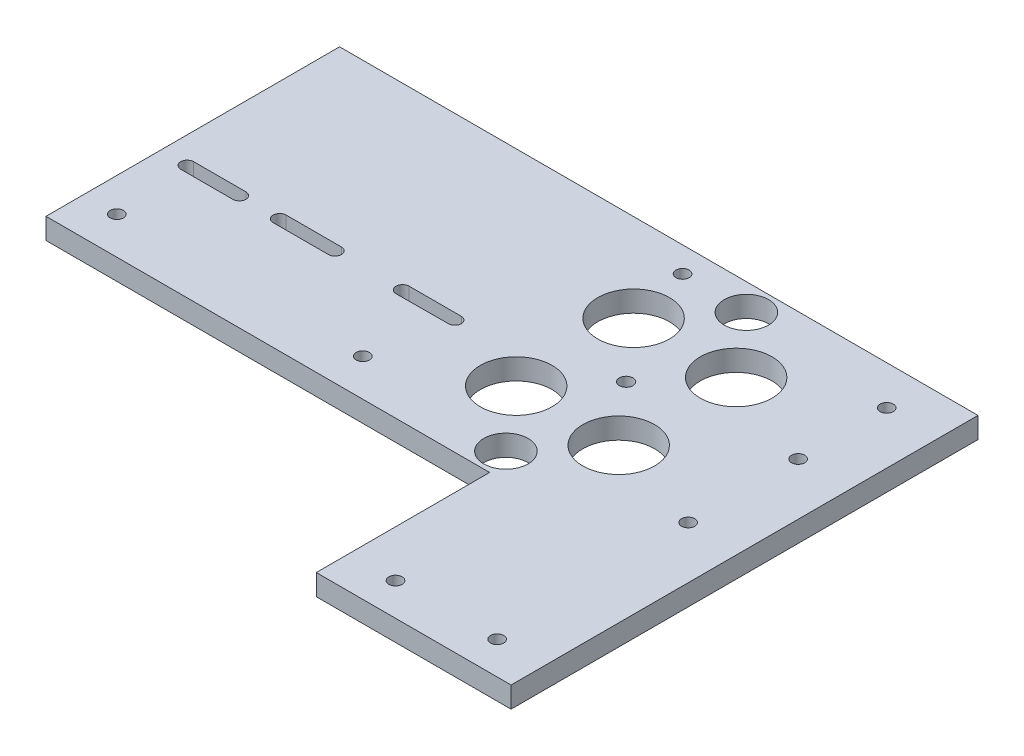
ISO-10303-21;
HEADER;
FILE_DESCRIPTION(('STEP AP214'),'2;1');
FILE_NAME('part.step','',(''),(''),'','','');
FILE_SCHEMA(('AUTOMOTIVE_DESIGN { 1 0 10303 214 1 1 1 1 }'));
ENDSEC;
DATA;
#1=APPLICATION_CONTEXT('core data for automotive mechanical design processes');
#2=APPLICATION_PROTOCOL_DEFINITION('international standard','automotive_design',2000,#1);
#3=PRODUCT_CONTEXT('',#1,'mechanical');
#4=PRODUCT('Part','Part','',(#3));
#5=PRODUCT_RELATED_PRODUCT_CATEGORY('part','',(#4));
#6=PRODUCT_DEFINITION_FORMATION('','',#4);
#7=PRODUCT_DEFINITION_CONTEXT('part definition',#1,'design');
#8=PRODUCT_DEFINITION('design','',#6,#7);
#9=PRODUCT_DEFINITION_SHAPE('','',#8);
#10=(LENGTH_UNIT() NAMED_UNIT(*) SI_UNIT(.MILLI.,.METRE.));
#11=(NAMED_UNIT(*) PLANE_ANGLE_UNIT() SI_UNIT($,.RADIAN.));
#12=(NAMED_UNIT(*) SI_UNIT($,.STERADIAN.) SOLID_ANGLE_UNIT());
#13=UNCERTAINTY_MEASURE_WITH_UNIT(LENGTH_MEASURE(1.E-05),#10,'distance_accuracy_value','');
#14=(GEOMETRIC_REPRESENTATION_CONTEXT(3) GLOBAL_UNCERTAINTY_ASSIGNED_CONTEXT((#13)) GLOBAL_UNIT_ASSIGNED_CONTEXT((#10,
#11,#12)) REPRESENTATION_CONTEXT('',''));
#15=CARTESIAN_POINT('',(0.,0.,0.));
#16=DIRECTION('',(0.,0.,1.));
#17=DIRECTION('',(1.,0.,0.));
#18=AXIS2_PLACEMENT_3D('',#15,#16,#17);
#19=CARTESIAN_POINT('',(55.88,5.715,0.));
#20=DIRECTION('',(1.,0.,0.));
#21=DIRECTION('',(0.,0.,-1.));
#22=AXIS2_PLACEMENT_3D('',#19,#20,#21);
#23=PLANE('',#22);
#24=DIRECTION('',(0.,0.,1.));
#25=VECTOR('',#24,1.);
#26=CARTESIAN_POINT('',(55.88,0.,0.));
#27=LINE('',#26,#25);
#28=CARTESIAN_POINT('',(55.88,0.,-40.005));
#29=VERTEX_POINT('',#28);
#30=CARTESIAN_POINT('',(55.88,0.,87.249));
#31=VERTEX_POINT('',#30);
#32=EDGE_CURVE('E314',#29,#31,#27,.T.);
#33=ORIENTED_EDGE('',*,*,#32,.F.);
#34=DIRECTION('',(0.,-1.,0.));
#35=VECTOR('',#34,1.);
#36=CARTESIAN_POINT('',(55.88,5.715,-40.005));
#37=LINE('',#36,#35);
#38=CARTESIAN_POINT('',(55.88,5.715,-40.005));
#39=VERTEX_POINT('',#38);
#40=EDGE_CURVE('E11',#39,#29,#37,.T.);
#41=ORIENTED_EDGE('',*,*,#40,.F.);
#42=DIRECTION('',(0.,0.,1.));
#43=VECTOR('',#42,1.);
#44=CARTESIAN_POINT('',(55.88,5.715,0.));
#45=LINE('',#44,#43);
#46=CARTESIAN_POINT('',(55.88,5.715,87.249));
#47=VERTEX_POINT('',#46);
#48=EDGE_CURVE('E315',#39,#47,#45,.T.);
#49=ORIENTED_EDGE('',*,*,#48,.T.);
#50=DIRECTION('',(0.,-1.,0.));
#51=VECTOR('',#50,1.);
#52=CARTESIAN_POINT('',(55.88,5.715,87.249));
#53=LINE('',#52,#51);
#54=EDGE_CURVE('E349',#47,#31,#53,.T.);
#55=ORIENTED_EDGE('',*,*,#54,.T.);
#56=EDGE_LOOP('',(#33,#41,#49,#55));
#57=FACE_BOUND('',#56,.T.);
#58=ADVANCED_FACE('F39',(#57),#23,.T.);
#59=CARTESIAN_POINT('',(0.,5.715,-40.005));
#60=DIRECTION('',(0.,0.,-1.));
#61=DIRECTION('',(-1.,0.,0.));
#62=AXIS2_PLACEMENT_3D('',#59,#60,#61);
#63=PLANE('',#62);
#64=DIRECTION('',(1.,0.,0.));
#65=VECTOR('',#64,1.);
#66=CARTESIAN_POINT('',(0.,0.,-40.005));
#67=LINE('',#66,#65);
#68=CARTESIAN_POINT('',(-118.11,0.,-40.005));
#69=VERTEX_POINT('',#68);
#70=EDGE_CURVE('E352',#69,#29,#67,.T.);
#71=ORIENTED_EDGE('',*,*,#70,.F.);
#72=DIRECTION('',(0.,-1.,0.));
#73=VECTOR('',#72,1.);
#74=CARTESIAN_POINT('',(-118.11,5.715,-40.005));
#75=LINE('',#74,#73);
#76=CARTESIAN_POINT('',(-118.11,5.715,-40.005));
#77=VERTEX_POINT('',#76);
#78=EDGE_CURVE('E46',#77,#69,#75,.T.);
#79=ORIENTED_EDGE('',*,*,#78,.F.);
#80=DIRECTION('',(1.,0.,0.));
#81=VECTOR('',#80,1.);
#82=CARTESIAN_POINT('',(0.,5.715,-40.005));
#83=LINE('',#82,#81);
#84=EDGE_CURVE('E318',#77,#39,#83,.T.);
#85=ORIENTED_EDGE('',*,*,#84,.T.);
#86=ORIENTED_EDGE('',*,*,#40,.T.);
#87=EDGE_LOOP('',(#71,#79,#85,#86));
#88=FACE_BOUND('',#87,.T.);
#89=ADVANCED_FACE('F402',(#88),#63,.T.);
#90=CARTESIAN_POINT('',(-118.11,5.715,0.));
#91=DIRECTION('',(1.,0.,0.));
#92=DIRECTION('',(0.,0.,-1.));
#93=AXIS2_PLACEMENT_3D('',#90,#91,#92);
#94=PLANE('',#93);
#95=DIRECTION('',(0.,0.,1.));
#96=VECTOR('',#95,1.);
#97=CARTESIAN_POINT('',(-118.11,0.,0.));
#98=LINE('',#97,#96);
#99=CARTESIAN_POINT('',(-118.11,0.,40.005));
#100=VERTEX_POINT('',#99);
#101=EDGE_CURVE('E355',#69,#100,#98,.T.);
#102=ORIENTED_EDGE('',*,*,#101,.T.);
#103=DIRECTION('',(0.,-1.,0.));
#104=VECTOR('',#103,1.);
#105=CARTESIAN_POINT('',(-118.11,5.715,40.005));
#106=LINE('',#105,#104);
#107=CARTESIAN_POINT('',(-118.11,5.715,40.005));
#108=VERTEX_POINT('',#107);
#109=EDGE_CURVE('E388',#108,#100,#106,.T.);
#110=ORIENTED_EDGE('',*,*,#109,.F.);
#111=DIRECTION('',(0.,0.,1.));
#112=VECTOR('',#111,1.);
#113=CARTESIAN_POINT('',(-118.11,5.715,0.));
#114=LINE('',#113,#112);
#115=EDGE_CURVE('E322',#77,#108,#114,.T.);
#116=ORIENTED_EDGE('',*,*,#115,.F.);
#117=ORIENTED_EDGE('',*,*,#78,.T.);
#118=EDGE_LOOP('',(#102,#110,#116,#117));
#119=FACE_BOUND('',#118,.T.);
#120=ADVANCED_FACE('F393',(#119),#94,.F.);
#121=CARTESIAN_POINT('',(0.,5.715,40.005));
#122=DIRECTION('',(0.,0.,-1.));
#123=DIRECTION('',(-1.,0.,0.));
#124=AXIS2_PLACEMENT_3D('',#121,#122,#123);
#125=PLANE('',#124);
#126=DIRECTION('',(1.,0.,0.));
#127=VECTOR('',#126,1.);
#128=CARTESIAN_POINT('',(0.,0.,40.005));
#129=LINE('',#128,#127);
#130=CARTESIAN_POINT('',(2.79400000000001,0.,40.005));
#131=VERTEX_POINT('',#130);
#132=EDGE_CURVE('E357',#100,#131,#129,.T.);
#133=ORIENTED_EDGE('',*,*,#132,.T.);
#134=DIRECTION('',(0.,-1.,0.));
#135=VECTOR('',#134,1.);
#136=CARTESIAN_POINT('',(2.79400000000001,5.715,40.005));
#137=LINE('',#136,#135);
#138=CARTESIAN_POINT('',(2.79400000000001,5.715,40.005));
#139=VERTEX_POINT('',#138);
#140=EDGE_CURVE('E385',#139,#131,#137,.T.);
#141=ORIENTED_EDGE('',*,*,#140,.F.);
#142=DIRECTION('',(1.,0.,0.));
#143=VECTOR('',#142,1.);
#144=CARTESIAN_POINT('',(0.,5.715,40.005));
#145=LINE('',#144,#143);
#146=EDGE_CURVE('E324',#108,#139,#145,.T.);
#147=ORIENTED_EDGE('',*,*,#146,.F.);
#148=ORIENTED_EDGE('',*,*,#109,.T.);
#149=EDGE_LOOP('',(#133,#141,#147,#148));
#150=FACE_BOUND('',#149,.T.);
#151=ADVANCED_FACE('F417',(#150),#125,.F.);
#152=CARTESIAN_POINT('',(2.79400000000001,5.715,0.));
#153=DIRECTION('',(1.,0.,0.));
#154=DIRECTION('',(0.,0.,-1.));
#155=AXIS2_PLACEMENT_3D('',#152,#153,#154);
#156=PLANE('',#155);
#157=DIRECTION('',(0.,0.,1.));
#158=VECTOR('',#157,1.);
#159=CARTESIAN_POINT('',(2.79400000000001,0.,0.));
#160=LINE('',#159,#158);
#161=CARTESIAN_POINT('',(2.79400000000002,0.,87.249));
#162=VERTEX_POINT('',#161);
#163=EDGE_CURVE('E359',#131,#162,#160,.T.);
#164=ORIENTED_EDGE('',*,*,#163,.T.);
#165=DIRECTION('',(0.,-1.,0.));
#166=VECTOR('',#165,1.);
#167=CARTESIAN_POINT('',(2.79400000000002,5.715,87.249));
#168=LINE('',#167,#166);
#169=CARTESIAN_POINT('',(2.79400000000002,5.715,87.249));
#170=VERTEX_POINT('',#169);
#171=EDGE_CURVE('E383',#170,#162,#168,.T.);
#172=ORIENTED_EDGE('',*,*,#171,.F.);
#173=DIRECTION('',(0.,0.,1.));
#174=VECTOR('',#173,1.);
#175=CARTESIAN_POINT('',(2.79400000000001,5.715,0.));
#176=LINE('',#175,#174);
#177=EDGE_CURVE('E326',#139,#170,#176,.T.);
#178=ORIENTED_EDGE('',*,*,#177,.F.);
#179=ORIENTED_EDGE('',*,*,#140,.T.);
#180=EDGE_LOOP('',(#164,#172,#178,#179));
#181=FACE_BOUND('',#180,.T.);
#182=ADVANCED_FACE('F413',(#181),#156,.F.);
#183=CARTESIAN_POINT('',(0.,5.715,-32.766));
#184=DIRECTION('',(0.,-1.,0.));
#185=DIRECTION('',(0.,0.,-1.));
#186=AXIS2_PLACEMENT_3D('',#183,#184,#185);
#187=CYLINDRICAL_SURFACE('',#186,6.0325);
#188=CARTESIAN_POINT('',(0.,5.715,-32.766));
#189=DIRECTION('',(0.,1.,0.));
#190=DIRECTION('',(0.,0.,1.));
#191=AXIS2_PLACEMENT_3D('',#188,#189,#190);
#192=CIRCLE('',#191,6.0325);
#193=CARTESIAN_POINT('',(0.,5.715,-26.7335));
#194=VERTEX_POINT('',#193);
#195=EDGE_CURVE('E343',#194,#194,#192,.T.);
#196=ORIENTED_EDGE('',*,*,#195,.T.);
#197=EDGE_LOOP('',(#196));
#198=FACE_BOUND('',#197,.T.);
#199=CARTESIAN_POINT('',(0.,0.,-32.766));
#200=DIRECTION('',(0.,1.,0.));
#201=DIRECTION('',(0.,0.,1.));
#202=AXIS2_PLACEMENT_3D('',#199,#200,#201);
#203=CIRCLE('',#202,6.0325);
#204=CARTESIAN_POINT('',(0.,0.,-26.7335));
#205=VERTEX_POINT('',#204);
#206=EDGE_CURVE('E377',#205,#205,#203,.T.);
#207=ORIENTED_EDGE('',*,*,#206,.F.);
#208=EDGE_LOOP('',(#207));
#209=FACE_BOUND('',#208,.T.);
#210=ADVANCED_FACE('F464',(#198,#209),#187,.F.);
#211=CARTESIAN_POINT('',(13.9699999999999,5.715,-16.002));
#212=DIRECTION('',(0.,-1.,0.));
#213=DIRECTION('',(0.,0.,-1.));
#214=AXIS2_PLACEMENT_3D('',#211,#212,#213);
#215=CYLINDRICAL_SURFACE('',#214,9.779);
#216=CARTESIAN_POINT('',(13.9699999999999,5.715,-16.002));
#217=DIRECTION('',(0.,1.,0.));
#218=DIRECTION('',(0.,0.,1.));
#219=AXIS2_PLACEMENT_3D('',#216,#217,#218);
#220=CIRCLE('',#219,9.779);
#221=CARTESIAN_POINT('',(13.9699999999999,5.715,-6.22300000000001));
#222=VERTEX_POINT('',#221);
#223=EDGE_CURVE('E340',#222,#222,#220,.F.);
#224=ORIENTED_EDGE('',*,*,#223,.F.);
#225=EDGE_LOOP('',(#224));
#226=FACE_BOUND('',#225,.T.);
#227=CARTESIAN_POINT('',(13.9699999999999,0.,-16.002));
#228=DIRECTION('',(0.,1.,0.));
#229=DIRECTION('',(0.,0.,1.));
#230=AXIS2_PLACEMENT_3D('',#227,#228,#229);
#231=CIRCLE('',#230,9.779);
#232=CARTESIAN_POINT('',(13.9699999999999,0.,-6.22300000000001));
#233=VERTEX_POINT('',#232);
#234=EDGE_CURVE('E374',#233,#233,#231,.F.);
#235=ORIENTED_EDGE('',*,*,#234,.T.);
#236=EDGE_LOOP('',(#235));
#237=FACE_BOUND('',#236,.T.);
#238=ADVANCED_FACE('F478',(#226,#237),#215,.F.);
#239=CARTESIAN_POINT('',(-13.97,5.715,-16.002));
#240=DIRECTION('',(0.,-1.,0.));
#241=DIRECTION('',(0.,0.,-1.));
#242=AXIS2_PLACEMENT_3D('',#239,#240,#241);
#243=CYLINDRICAL_SURFACE('',#242,9.779);
#244=CARTESIAN_POINT('',(-13.97,5.715,-16.002));
#245=DIRECTION('',(0.,1.,0.));
#246=DIRECTION('',(0.,0.,1.));
#247=AXIS2_PLACEMENT_3D('',#244,#245,#246);
#248=CIRCLE('',#247,9.779);
#249=CARTESIAN_POINT('',(-13.97,5.715,-6.223));
#250=VERTEX_POINT('',#249);
#251=EDGE_CURVE('E337',#250,#250,#248,.T.);
#252=ORIENTED_EDGE('',*,*,#251,.T.);
#253=EDGE_LOOP('',(#252));
#254=FACE_BOUND('',#253,.T.);
#255=CARTESIAN_POINT('',(-13.97,0.,-16.002));
#256=DIRECTION('',(0.,1.,0.));
#257=DIRECTION('',(0.,0.,1.));
#258=AXIS2_PLACEMENT_3D('',#255,#256,#257);
#259=CIRCLE('',#258,9.779);
#260=CARTESIAN_POINT('',(-13.97,0.,-6.223));
#261=VERTEX_POINT('',#260);
#262=EDGE_CURVE('E371',#261,#261,#259,.T.);
#263=ORIENTED_EDGE('',*,*,#262,.F.);
#264=EDGE_LOOP('',(#263));
#265=FACE_BOUND('',#264,.T.);
#266=ADVANCED_FACE('F474',(#254,#265),#243,.F.);
#267=CARTESIAN_POINT('',(13.9699999999999,5.715,16.002));
#268=DIRECTION('',(0.,-1.,0.));
#269=DIRECTION('',(0.,0.,-1.));
#270=AXIS2_PLACEMENT_3D('',#267,#268,#269);
#271=CYLINDRICAL_SURFACE('',#270,9.779);
#272=CARTESIAN_POINT('',(13.9699999999999,5.715,16.002));
#273=DIRECTION('',(0.,1.,0.));
#274=DIRECTION('',(0.,0.,1.));
#275=AXIS2_PLACEMENT_3D('',#272,#273,#274);
#276=CIRCLE('',#275,9.779);
#277=CARTESIAN_POINT('',(13.9699999999999,5.715,25.781));
#278=VERTEX_POINT('',#277);
#279=EDGE_CURVE('E334',#278,#278,#276,.T.);
#280=ORIENTED_EDGE('',*,*,#279,.T.);
#281=EDGE_LOOP('',(#280));
#282=FACE_BOUND('',#281,.T.);
#283=CARTESIAN_POINT('',(13.9699999999999,0.,16.002));
#284=DIRECTION('',(0.,1.,0.));
#285=DIRECTION('',(0.,0.,1.));
#286=AXIS2_PLACEMENT_3D('',#283,#284,#285);
#287=CIRCLE('',#286,9.779);
#288=CARTESIAN_POINT('',(13.9699999999999,0.,25.781));
#289=VERTEX_POINT('',#288);
#290=EDGE_CURVE('E368',#289,#289,#287,.T.);
#291=ORIENTED_EDGE('',*,*,#290,.F.);
#292=EDGE_LOOP('',(#291));
#293=FACE_BOUND('',#292,.T.);
#294=ADVANCED_FACE('F470',(#282,#293),#271,.F.);
#295=CARTESIAN_POINT('',(-13.97,5.715,16.002));
#296=DIRECTION('',(0.,-1.,0.));
#297=DIRECTION('',(0.,0.,-1.));
#298=AXIS2_PLACEMENT_3D('',#295,#296,#297);
#299=CYLINDRICAL_SURFACE('',#298,9.779);
#300=CARTESIAN_POINT('',(-13.97,5.715,16.002));
#301=DIRECTION('',(0.,1.,0.));
#302=DIRECTION('',(0.,0.,1.));
#303=AXIS2_PLACEMENT_3D('',#300,#301,#302);
#304=CIRCLE('',#303,9.779);
#305=CARTESIAN_POINT('',(-13.97,5.715,25.781));
#306=VERTEX_POINT('',#305);
#307=EDGE_CURVE('E331',#306,#306,#304,.F.);
#308=ORIENTED_EDGE('',*,*,#307,.F.);
#309=EDGE_LOOP('',(#308));
#310=FACE_BOUND('',#309,.T.);
#311=CARTESIAN_POINT('',(-13.97,0.,16.002));
#312=DIRECTION('',(0.,1.,0.));
#313=DIRECTION('',(0.,0.,1.));
#314=AXIS2_PLACEMENT_3D('',#311,#312,#313);
#315=CIRCLE('',#314,9.779);
#316=CARTESIAN_POINT('',(-13.97,0.,25.781));
#317=VERTEX_POINT('',#316);
#318=EDGE_CURVE('E365',#317,#317,#315,.F.);
#319=ORIENTED_EDGE('',*,*,#318,.T.);
#320=EDGE_LOOP('',(#319));
#321=FACE_BOUND('',#320,.T.);
#322=ADVANCED_FACE('F467',(#310,#321),#299,.F.);
#323=CARTESIAN_POINT('',(0.,5.715,87.249));
#324=DIRECTION('',(0.,0.,1.));
#325=DIRECTION('',(1.,0.,0.));
#326=AXIS2_PLACEMENT_3D('',#323,#324,#325);
#327=PLANE('',#326);
#328=DIRECTION('',(-1.,0.,0.));
#329=VECTOR('',#328,1.);
#330=CARTESIAN_POINT('',(0.,0.,87.249));
#331=LINE('',#330,#329);
#332=EDGE_CURVE('E362',#31,#162,#331,.T.);
#333=ORIENTED_EDGE('',*,*,#332,.F.);
#334=ORIENTED_EDGE('',*,*,#54,.F.);
#335=DIRECTION('',(-1.,0.,0.));
#336=VECTOR('',#335,1.);
#337=CARTESIAN_POINT('',(0.,5.715,87.249));
#338=LINE('',#337,#336);
#339=EDGE_CURVE('E328',#47,#170,#338,.T.);
#340=ORIENTED_EDGE('',*,*,#339,.T.);
#341=ORIENTED_EDGE('',*,*,#171,.T.);
#342=EDGE_LOOP('',(#333,#334,#340,#341));
#343=FACE_BOUND('',#342,.T.);
#344=ADVANCED_FACE('F408',(#343),#327,.T.);
#345=CARTESIAN_POINT('',(0.,5.715,32.766));
#346=DIRECTION('',(0.,-1.,0.));
#347=DIRECTION('',(0.,0.,-1.));
#348=AXIS2_PLACEMENT_3D('',#345,#346,#347);
#349=CYLINDRICAL_SURFACE('',#348,6.0325);
#350=CARTESIAN_POINT('',(0.,5.715,32.766));
#351=DIRECTION('',(0.,1.,0.));
#352=DIRECTION('',(0.,0.,1.));
#353=AXIS2_PLACEMENT_3D('',#350,#351,#352);
#354=CIRCLE('',#353,6.0325);
#355=CARTESIAN_POINT('',(0.,5.715,38.7985));
#356=VERTEX_POINT('',#355);
#357=EDGE_CURVE('E346',#356,#356,#354,.F.);
#358=ORIENTED_EDGE('',*,*,#357,.F.);
#359=EDGE_LOOP('',(#358));
#360=FACE_BOUND('',#359,.T.);
#361=CARTESIAN_POINT('',(0.,0.,32.766));
#362=DIRECTION('',(0.,1.,0.));
#363=DIRECTION('',(0.,0.,1.));
#364=AXIS2_PLACEMENT_3D('',#361,#362,#363);
#365=CIRCLE('',#364,6.0325);
#366=CARTESIAN_POINT('',(0.,0.,38.7985));
#367=VERTEX_POINT('',#366);
#368=EDGE_CURVE('E319',#367,#367,#365,.F.);
#369=ORIENTED_EDGE('',*,*,#368,.T.);
#370=EDGE_LOOP('',(#369));
#371=FACE_BOUND('',#370,.T.);
#372=ADVANCED_FACE('F422',(#360,#371),#349,.F.);
#373=CARTESIAN_POINT('',(0.,5.715,0.));
#374=DIRECTION('',(0.,1.,0.));
#375=DIRECTION('',(0.,0.,1.));
#376=AXIS2_PLACEMENT_3D('',#373,#374,#375);
#377=PLANE('',#376);
#378=DIRECTION('',(1.,0.,0.));
#379=VECTOR('',#378,1.);
#380=CARTESIAN_POINT('',(0.,5.715,10.5429108225078));
#381=LINE('',#380,#379);
#382=CARTESIAN_POINT('',(-85.6801299019769,5.715,10.5429108225078));
#383=VERTEX_POINT('',#382);
#384=CARTESIAN_POINT('',(-70.6016181600227,5.715,10.5429108225078));
#385=VERTEX_POINT('',#384);
#386=EDGE_CURVE('E53',#383,#385,#381,.T.);
#387=ORIENTED_EDGE('',*,*,#386,.F.);
#388=CARTESIAN_POINT('',(-85.6801299019769,5.715,8.76300000000002));
#389=DIRECTION('',(0.,1.,0.));
#390=DIRECTION('',(0.,0.,1.));
#391=AXIS2_PLACEMENT_3D('',#388,#389,#390);
#392=CIRCLE('',#391,1.77991082250782);
#393=CARTESIAN_POINT('',(-85.6801299019769,5.715,6.9830891774922));
#394=VERTEX_POINT('',#393);
#395=EDGE_CURVE('E171',#394,#383,#392,.T.);
#396=ORIENTED_EDGE('',*,*,#395,.F.);
#397=DIRECTION('',(1.,0.,0.));
#398=VECTOR('',#397,1.);
#399=CARTESIAN_POINT('',(0.,5.715,6.98308917749221));
#400=LINE('',#399,#398);
#401=CARTESIAN_POINT('',(-70.6016181600227,5.715,6.9830891774922));
#402=VERTEX_POINT('',#401);
#403=EDGE_CURVE('E194',#394,#402,#400,.T.);
#404=ORIENTED_EDGE('',*,*,#403,.T.);
#405=CARTESIAN_POINT('',(-70.6016181600227,5.715,8.76300000000002));
#406=DIRECTION('',(0.,1.,0.));
#407=DIRECTION('',(0.,0.,1.));
#408=AXIS2_PLACEMENT_3D('',#405,#406,#407);
#409=CIRCLE('',#408,1.77991082250782);
#410=EDGE_CURVE('E187',#385,#402,#409,.T.);
#411=ORIENTED_EDGE('',*,*,#410,.F.);
#412=EDGE_LOOP('',(#387,#396,#404,#411));
#413=FACE_BOUND('',#412,.T.);
#414=CARTESIAN_POINT('',(-96.6529445962825,5.715,8.76300000000002));
#415=DIRECTION('',(0.,1.,0.));
#416=DIRECTION('',(0.,0.,1.));
#417=AXIS2_PLACEMENT_3D('',#414,#415,#416);
#418=CIRCLE('',#417,1.77800000000001);
#419=CARTESIAN_POINT('',(-96.6529445962825,5.715,10.541));
#420=VERTEX_POINT('',#419);
#421=CARTESIAN_POINT('',(-96.6529445962825,5.715,6.98500000000002));
#422=VERTEX_POINT('',#421);
#423=EDGE_CURVE('E61',#420,#422,#418,.T.);
#424=ORIENTED_EDGE('',*,*,#423,.F.);
#425=DIRECTION('',(0.999999990976662,0.,0.000134337915340916));
#426=VECTOR('',#425,1.);
#427=CARTESIAN_POINT('',(-0.00141780021715812,5.715,10.5539839647415));
#428=LINE('',#427,#426);
#429=CARTESIAN_POINT('',(-110.876944467935,5.715,10.5390891774922));
#430=VERTEX_POINT('',#429);
#431=EDGE_CURVE('E217',#430,#420,#428,.T.);
#432=ORIENTED_EDGE('',*,*,#431,.F.);
#433=CARTESIAN_POINT('',(-110.876944467935,5.715,8.76108917749221));
#434=DIRECTION('',(0.,1.,0.));
#435=DIRECTION('',(0.,0.,1.));
#436=AXIS2_PLACEMENT_3D('',#433,#434,#435);
#437=CIRCLE('',#436,1.77800000000001);
#438=CARTESIAN_POINT('',(-110.876944467935,5.715,6.98308917749221));
#439=VERTEX_POINT('',#438);
#440=EDGE_CURVE('E214',#439,#430,#437,.T.);
#441=ORIENTED_EDGE('',*,*,#440,.F.);
#442=DIRECTION('',(0.999999990976662,0.,0.000134337915340916));
#443=VECTOR('',#442,1.);
#444=CARTESIAN_POINT('',(-0.000940094594516318,5.715,6.99798402891546));
#445=LINE('',#444,#443);
#446=EDGE_CURVE('E211',#439,#422,#445,.T.);
#447=ORIENTED_EDGE('',*,*,#446,.T.);
#448=EDGE_LOOP('',(#424,#432,#441,#447));
#449=FACE_BOUND('',#448,.T.);
#450=CARTESIAN_POINT('',(-37.9130723361808,5.715,8.76300000000002));
#451=DIRECTION('',(0.,1.,0.));
#452=DIRECTION('',(0.,0.,1.));
#453=AXIS2_PLACEMENT_3D('',#450,#451,#452);
#454=CIRCLE('',#453,1.75083159914467);
#455=CARTESIAN_POINT('',(-37.9130723361808,5.715,10.5138315991447));
#456=VERTEX_POINT('',#455);
#457=CARTESIAN_POINT('',(-37.9130723361808,5.715,7.01216840085537));
#458=VERTEX_POINT('',#457);
#459=EDGE_CURVE('E237',#456,#458,#454,.T.);
#460=ORIENTED_EDGE('',*,*,#459,.F.);
#461=DIRECTION('',(0.999986316175117,0.,-0.0052313920250359));
#462=VECTOR('',#461,1.);
#463=CARTESIAN_POINT('',(0.053963637556781,5.715,10.3152084320128));
#464=LINE('',#463,#462);
#465=CARTESIAN_POINT('',(-52.1370723361808,5.715,10.5882439375542));
#466=VERTEX_POINT('',#465);
#467=EDGE_CURVE('E245',#466,#456,#464,.T.);
#468=ORIENTED_EDGE('',*,*,#467,.F.);
#469=CARTESIAN_POINT('',(-52.1370723361808,5.715,8.80020616920478));
#470=DIRECTION('',(0.,1.,0.));
#471=DIRECTION('',(0.,0.,1.));
#472=AXIS2_PLACEMENT_3D('',#469,#470,#471);
#473=CIRCLE('',#472,1.78803776834941);
#474=CARTESIAN_POINT('',(-52.1370723361808,5.715,7.01216840085537));
#475=VERTEX_POINT('',#474);
#476=EDGE_CURVE('E242',#475,#466,#473,.T.);
#477=ORIENTED_EDGE('',*,*,#476,.F.);
#478=DIRECTION('',(1.,0.,0.));
#479=VECTOR('',#478,1.);
#480=CARTESIAN_POINT('',(0.,5.715,7.01216840085537));
#481=LINE('',#480,#479);
#482=EDGE_CURVE('E239',#475,#458,#481,.T.);
#483=ORIENTED_EDGE('',*,*,#482,.T.);
#484=EDGE_LOOP('',(#460,#468,#477,#483));
#485=FACE_BOUND('',#484,.T.);
#486=CARTESIAN_POINT('',(0.,5.715,0.));
#487=DIRECTION('',(0.,1.,0.));
#488=DIRECTION('',(0.,0.,1.));
#489=AXIS2_PLACEMENT_3D('',#486,#487,#488);
#490=CIRCLE('',#489,1.84999999999999);
#491=CARTESIAN_POINT('',(0.,5.715,1.84999999999999));
#492=VERTEX_POINT('',#491);
#493=EDGE_CURVE('E260',#492,#492,#490,.T.);
#494=ORIENTED_EDGE('',*,*,#493,.F.);
#495=EDGE_LOOP('',(#494));
#496=FACE_BOUND('',#495,.T.);
#497=CARTESIAN_POINT('',(-17.78,5.715,-33.147));
#498=DIRECTION('',(0.,1.,0.));
#499=DIRECTION('',(0.,0.,1.));
#500=AXIS2_PLACEMENT_3D('',#497,#498,#499);
#501=CIRCLE('',#500,1.79999999999999);
#502=CARTESIAN_POINT('',(-17.78,5.715,-31.347));
#503=VERTEX_POINT('',#502);
#504=EDGE_CURVE('E266',#503,#503,#501,.T.);
#505=ORIENTED_EDGE('',*,*,#504,.F.);
#506=EDGE_LOOP('',(#505));
#507=FACE_BOUND('',#506,.T.);
#508=CARTESIAN_POINT('',(41.656,5.715,-29.337));
#509=DIRECTION('',(0.,1.,0.));
#510=DIRECTION('',(0.,0.,1.));
#511=AXIS2_PLACEMENT_3D('',#508,#509,#510);
#512=CIRCLE('',#511,1.79999999999999);
#513=CARTESIAN_POINT('',(41.656,5.715,-27.537));
#514=VERTEX_POINT('',#513);
#515=EDGE_CURVE('E272',#514,#514,#512,.T.);
#516=ORIENTED_EDGE('',*,*,#515,.F.);
#517=EDGE_LOOP('',(#516));
#518=FACE_BOUND('',#517,.T.);
#519=CARTESIAN_POINT('',(41.656,5.715,-5.20699999999998));
#520=DIRECTION('',(0.,1.,0.));
#521=DIRECTION('',(0.,0.,1.));
#522=AXIS2_PLACEMENT_3D('',#519,#520,#521);
#523=CIRCLE('',#522,1.79999999999999);
#524=CARTESIAN_POINT('',(41.656,5.715,-3.40699999999999));
#525=VERTEX_POINT('',#524);
#526=EDGE_CURVE('E278',#525,#525,#523,.T.);
#527=ORIENTED_EDGE('',*,*,#526,.F.);
#528=EDGE_LOOP('',(#527));
#529=FACE_BOUND('',#528,.T.);
#530=CARTESIAN_POINT('',(41.656,5.715,24.765));
#531=DIRECTION('',(0.,1.,0.));
#532=DIRECTION('',(0.,0.,1.));
#533=AXIS2_PLACEMENT_3D('',#530,#531,#532);
#534=CIRCLE('',#533,1.79999999999999);
#535=CARTESIAN_POINT('',(41.656,5.715,26.565));
#536=VERTEX_POINT('',#535);
#537=EDGE_CURVE('E284',#536,#536,#534,.T.);
#538=ORIENTED_EDGE('',*,*,#537,.F.);
#539=EDGE_LOOP('',(#538));
#540=FACE_BOUND('',#539,.T.);
#541=CARTESIAN_POINT('',(43.18,5.715,78.359));
#542=DIRECTION('',(0.,1.,0.));
#543=DIRECTION('',(0.,0.,1.));
#544=AXIS2_PLACEMENT_3D('',#541,#542,#543);
#545=CIRCLE('',#544,1.79999999999999);
#546=CARTESIAN_POINT('',(43.18,5.715,80.159));
#547=VERTEX_POINT('',#546);
#548=EDGE_CURVE('E290',#547,#547,#545,.T.);
#549=ORIENTED_EDGE('',*,*,#548,.F.);
#550=EDGE_LOOP('',(#549));
#551=FACE_BOUND('',#550,.T.);
#552=CARTESIAN_POINT('',(15.494,5.715,78.359));
#553=DIRECTION('',(0.,1.,0.));
#554=DIRECTION('',(0.,0.,1.));
#555=AXIS2_PLACEMENT_3D('',#552,#553,#554);
#556=CIRCLE('',#555,1.79999999999999);
#557=CARTESIAN_POINT('',(15.494,5.715,80.159));
#558=VERTEX_POINT('',#557);
#559=EDGE_CURVE('E296',#558,#558,#556,.T.);
#560=ORIENTED_EDGE('',*,*,#559,.F.);
#561=EDGE_LOOP('',(#560));
#562=FACE_BOUND('',#561,.T.);
#563=CARTESIAN_POINT('',(-41.91,5.715,29.845));
#564=DIRECTION('',(0.,1.,0.));
#565=DIRECTION('',(0.,0.,1.));
#566=AXIS2_PLACEMENT_3D('',#563,#564,#565);
#567=CIRCLE('',#566,1.79999999999999);
#568=CARTESIAN_POINT('',(-41.91,5.715,31.645));
#569=VERTEX_POINT('',#568);
#570=EDGE_CURVE('E302',#569,#569,#567,.T.);
#571=ORIENTED_EDGE('',*,*,#570,.F.);
#572=EDGE_LOOP('',(#571));
#573=FACE_BOUND('',#572,.T.);
#574=CARTESIAN_POINT('',(-108.966,5.715,29.845));
#575=DIRECTION('',(0.,1.,0.));
#576=DIRECTION('',(0.,0.,1.));
#577=AXIS2_PLACEMENT_3D('',#574,#575,#576);
#578=CIRCLE('',#577,1.79999999999998);
#579=CARTESIAN_POINT('',(-108.966,5.715,31.645));
#580=VERTEX_POINT('',#579);
#581=EDGE_CURVE('E308',#580,#580,#578,.T.);
#582=ORIENTED_EDGE('',*,*,#581,.F.);
#583=EDGE_LOOP('',(#582));
#584=FACE_BOUND('',#583,.T.);
#585=ORIENTED_EDGE('',*,*,#48,.F.);
#586=ORIENTED_EDGE('',*,*,#84,.F.);
#587=ORIENTED_EDGE('',*,*,#115,.T.);
#588=ORIENTED_EDGE('',*,*,#146,.T.);
#589=ORIENTED_EDGE('',*,*,#177,.T.);
#590=ORIENTED_EDGE('',*,*,#339,.F.);
#591=EDGE_LOOP('',(#585,#586,#587,#588,#589,#590));
#592=FACE_BOUND('',#591,.T.);
#593=ORIENTED_EDGE('',*,*,#307,.T.);
#594=EDGE_LOOP('',(#593));
#595=FACE_BOUND('',#594,.T.);
#596=ORIENTED_EDGE('',*,*,#279,.F.);
#597=EDGE_LOOP('',(#596));
#598=FACE_BOUND('',#597,.T.);
#599=ORIENTED_EDGE('',*,*,#251,.F.);
#600=EDGE_LOOP('',(#599));
#601=FACE_BOUND('',#600,.T.);
#602=ORIENTED_EDGE('',*,*,#223,.T.);
#603=EDGE_LOOP('',(#602));
#604=FACE_BOUND('',#603,.T.);
#605=ORIENTED_EDGE('',*,*,#195,.F.);
#606=EDGE_LOOP('',(#605));
#607=FACE_BOUND('',#606,.T.);
#608=ORIENTED_EDGE('',*,*,#357,.T.);
#609=EDGE_LOOP('',(#608));
#610=FACE_BOUND('',#609,.T.);
#611=ADVANCED_FACE('F419',(#413,#449,#485,#496,#507,#518,#529,#540,#551,#562,#573,#584,#592,
#595,#598,#601,#604,#607,#610),#377,.T.);
#612=CARTESIAN_POINT('',(0.,0.,0.));
#613=DIRECTION('',(0.,1.,0.));
#614=DIRECTION('',(0.,0.,1.));
#615=AXIS2_PLACEMENT_3D('',#612,#613,#614);
#616=PLANE('',#615);
#617=CARTESIAN_POINT('',(-85.6801299019769,0.,8.76300000000002));
#618=DIRECTION('',(0.,1.,0.));
#619=DIRECTION('',(0.,0.,1.));
#620=AXIS2_PLACEMENT_3D('',#617,#618,#619);
#621=CIRCLE('',#620,1.77991082250782);
#622=CARTESIAN_POINT('',(-85.6801299019769,0.,10.5429108225078));
#623=VERTEX_POINT('',#622);
#624=CARTESIAN_POINT('',(-85.6801299019769,0.,6.9830891774922));
#625=VERTEX_POINT('',#624);
#626=EDGE_CURVE('E185',#623,#625,#621,.F.);
#627=ORIENTED_EDGE('',*,*,#626,.F.);
#628=DIRECTION('',(-1.,0.,0.));
#629=VECTOR('',#628,1.);
#630=CARTESIAN_POINT('',(0.,0.,10.5429108225078));
#631=LINE('',#630,#629);
#632=CARTESIAN_POINT('',(-70.6016181600227,0.,10.5429108225078));
#633=VERTEX_POINT('',#632);
#634=EDGE_CURVE('E165',#633,#623,#631,.T.);
#635=ORIENTED_EDGE('',*,*,#634,.F.);
#636=CARTESIAN_POINT('',(-70.6016181600227,0.,8.76300000000002));
#637=DIRECTION('',(0.,1.,0.));
#638=DIRECTION('',(0.,0.,1.));
#639=AXIS2_PLACEMENT_3D('',#636,#637,#638);
#640=CIRCLE('',#639,1.77991082250782);
#641=CARTESIAN_POINT('',(-70.6016181600227,0.,6.9830891774922));
#642=VERTEX_POINT('',#641);
#643=EDGE_CURVE('E175',#642,#633,#640,.F.);
#644=ORIENTED_EDGE('',*,*,#643,.F.);
#645=DIRECTION('',(-1.,0.,0.));
#646=VECTOR('',#645,1.);
#647=CARTESIAN_POINT('',(0.,0.,6.98308917749221));
#648=LINE('',#647,#646);
#649=EDGE_CURVE('E189',#642,#625,#648,.T.);
#650=ORIENTED_EDGE('',*,*,#649,.T.);
#651=EDGE_LOOP('',(#627,#635,#644,#650));
#652=FACE_BOUND('',#651,.T.);
#653=DIRECTION('',(-0.999999990976662,0.,-0.000134337915340916));
#654=VECTOR('',#653,1.);
#655=CARTESIAN_POINT('',(-0.00141780021715812,0.,10.5539839647415));
#656=LINE('',#655,#654);
#657=CARTESIAN_POINT('',(-96.6529445962825,0.,10.541));
#658=VERTEX_POINT('',#657);
#659=CARTESIAN_POINT('',(-110.876944467935,0.,10.5390891774922));
#660=VERTEX_POINT('',#659);
#661=EDGE_CURVE('E206',#658,#660,#656,.T.);
#662=ORIENTED_EDGE('',*,*,#661,.F.);
#663=CARTESIAN_POINT('',(-96.6529445962825,0.,8.76300000000002));
#664=DIRECTION('',(0.,1.,0.));
#665=DIRECTION('',(0.,0.,1.));
#666=AXIS2_PLACEMENT_3D('',#663,#664,#665);
#667=CIRCLE('',#666,1.77800000000001);
#668=CARTESIAN_POINT('',(-96.6529445962825,0.,6.98500000000002));
#669=VERTEX_POINT('',#668);
#670=EDGE_CURVE('E208',#669,#658,#667,.F.);
#671=ORIENTED_EDGE('',*,*,#670,.F.);
#672=DIRECTION('',(-0.999999990976662,0.,-0.000134337915340916));
#673=VECTOR('',#672,1.);
#674=CARTESIAN_POINT('',(-0.000940094594516318,0.,6.99798402891546));
#675=LINE('',#674,#673);
#676=CARTESIAN_POINT('',(-110.876944467935,0.,6.98308917749221));
#677=VERTEX_POINT('',#676);
#678=EDGE_CURVE('E223',#669,#677,#675,.T.);
#679=ORIENTED_EDGE('',*,*,#678,.T.);
#680=CARTESIAN_POINT('',(-110.876944467935,0.,8.76108917749221));
#681=DIRECTION('',(0.,1.,0.));
#682=DIRECTION('',(0.,0.,1.));
#683=AXIS2_PLACEMENT_3D('',#680,#681,#682);
#684=CIRCLE('',#683,1.77800000000001);
#685=EDGE_CURVE('E203',#660,#677,#684,.F.);
#686=ORIENTED_EDGE('',*,*,#685,.F.);
#687=EDGE_LOOP('',(#662,#671,#679,#686));
#688=FACE_BOUND('',#687,.T.);
#689=DIRECTION('',(-0.999986316175117,0.,0.0052313920250359));
#690=VECTOR('',#689,1.);
#691=CARTESIAN_POINT('',(0.053963637556781,0.,10.3152084320128));
#692=LINE('',#691,#690);
#693=CARTESIAN_POINT('',(-37.9130723361808,0.,10.5138315991447));
#694=VERTEX_POINT('',#693);
#695=CARTESIAN_POINT('',(-52.1370723361808,0.,10.5882439375542));
#696=VERTEX_POINT('',#695);
#697=EDGE_CURVE('E233',#694,#696,#692,.T.);
#698=ORIENTED_EDGE('',*,*,#697,.F.);
#699=CARTESIAN_POINT('',(-37.9130723361808,0.,8.76300000000002));
#700=DIRECTION('',(0.,1.,0.));
#701=DIRECTION('',(0.,0.,1.));
#702=AXIS2_PLACEMENT_3D('',#699,#700,#701);
#703=CIRCLE('',#702,1.75083159914467);
#704=CARTESIAN_POINT('',(-37.9130723361808,0.,7.01216840085537));
#705=VERTEX_POINT('',#704);
#706=EDGE_CURVE('E235',#705,#694,#703,.F.);
#707=ORIENTED_EDGE('',*,*,#706,.F.);
#708=DIRECTION('',(-1.,0.,0.));
#709=VECTOR('',#708,1.);
#710=CARTESIAN_POINT('',(0.,0.,7.01216840085537));
#711=LINE('',#710,#709);
#712=CARTESIAN_POINT('',(-52.1370723361808,0.,7.01216840085537));
#713=VERTEX_POINT('',#712);
#714=EDGE_CURVE('E251',#705,#713,#711,.T.);
#715=ORIENTED_EDGE('',*,*,#714,.T.);
#716=CARTESIAN_POINT('',(-52.1370723361808,0.,8.80020616920478));
#717=DIRECTION('',(0.,1.,0.));
#718=DIRECTION('',(0.,0.,1.));
#719=AXIS2_PLACEMENT_3D('',#716,#717,#718);
#720=CIRCLE('',#719,1.78803776834941);
#721=EDGE_CURVE('E179',#696,#713,#720,.F.);
#722=ORIENTED_EDGE('',*,*,#721,.F.);
#723=EDGE_LOOP('',(#698,#707,#715,#722));
#724=FACE_BOUND('',#723,.T.);
#725=CARTESIAN_POINT('',(0.,0.,0.));
#726=DIRECTION('',(0.,1.,0.));
#727=DIRECTION('',(0.,0.,1.));
#728=AXIS2_PLACEMENT_3D('',#725,#726,#727);
#729=CIRCLE('',#728,1.84999999999999);
#730=CARTESIAN_POINT('',(0.,0.,1.84999999999999));
#731=VERTEX_POINT('',#730);
#732=EDGE_CURVE('E263',#731,#731,#729,.T.);
#733=ORIENTED_EDGE('',*,*,#732,.T.);
#734=EDGE_LOOP('',(#733));
#735=FACE_BOUND('',#734,.T.);
#736=CARTESIAN_POINT('',(-17.78,0.,-33.147));
#737=DIRECTION('',(0.,1.,0.));
#738=DIRECTION('',(0.,0.,1.));
#739=AXIS2_PLACEMENT_3D('',#736,#737,#738);
#740=CIRCLE('',#739,1.79999999999999);
#741=CARTESIAN_POINT('',(-17.78,0.,-31.347));
#742=VERTEX_POINT('',#741);
#743=EDGE_CURVE('E269',#742,#742,#740,.T.);
#744=ORIENTED_EDGE('',*,*,#743,.T.);
#745=EDGE_LOOP('',(#744));
#746=FACE_BOUND('',#745,.T.);
#747=CARTESIAN_POINT('',(41.656,0.,-29.337));
#748=DIRECTION('',(0.,1.,0.));
#749=DIRECTION('',(0.,0.,1.));
#750=AXIS2_PLACEMENT_3D('',#747,#748,#749);
#751=CIRCLE('',#750,1.79999999999999);
#752=CARTESIAN_POINT('',(41.656,0.,-27.537));
#753=VERTEX_POINT('',#752);
#754=EDGE_CURVE('E275',#753,#753,#751,.T.);
#755=ORIENTED_EDGE('',*,*,#754,.T.);
#756=EDGE_LOOP('',(#755));
#757=FACE_BOUND('',#756,.T.);
#758=CARTESIAN_POINT('',(41.656,0.,-5.20699999999998));
#759=DIRECTION('',(0.,1.,0.));
#760=DIRECTION('',(0.,0.,1.));
#761=AXIS2_PLACEMENT_3D('',#758,#759,#760);
#762=CIRCLE('',#761,1.79999999999999);
#763=CARTESIAN_POINT('',(41.656,0.,-3.407));
#764=VERTEX_POINT('',#763);
#765=EDGE_CURVE('E281',#764,#764,#762,.T.);
#766=ORIENTED_EDGE('',*,*,#765,.T.);
#767=EDGE_LOOP('',(#766));
#768=FACE_BOUND('',#767,.T.);
#769=CARTESIAN_POINT('',(41.656,0.,24.765));
#770=DIRECTION('',(0.,1.,0.));
#771=DIRECTION('',(0.,0.,1.));
#772=AXIS2_PLACEMENT_3D('',#769,#770,#771);
#773=CIRCLE('',#772,1.79999999999999);
#774=CARTESIAN_POINT('',(41.656,0.,26.565));
#775=VERTEX_POINT('',#774);
#776=EDGE_CURVE('E287',#775,#775,#773,.T.);
#777=ORIENTED_EDGE('',*,*,#776,.T.);
#778=EDGE_LOOP('',(#777));
#779=FACE_BOUND('',#778,.T.);
#780=CARTESIAN_POINT('',(43.18,0.,78.359));
#781=DIRECTION('',(0.,1.,0.));
#782=DIRECTION('',(0.,0.,1.));
#783=AXIS2_PLACEMENT_3D('',#780,#781,#782);
#784=CIRCLE('',#783,1.79999999999999);
#785=CARTESIAN_POINT('',(43.18,0.,80.159));
#786=VERTEX_POINT('',#785);
#787=EDGE_CURVE('E293',#786,#786,#784,.T.);
#788=ORIENTED_EDGE('',*,*,#787,.T.);
#789=EDGE_LOOP('',(#788));
#790=FACE_BOUND('',#789,.T.);
#791=CARTESIAN_POINT('',(15.494,0.,78.359));
#792=DIRECTION('',(0.,1.,0.));
#793=DIRECTION('',(0.,0.,1.));
#794=AXIS2_PLACEMENT_3D('',#791,#792,#793);
#795=CIRCLE('',#794,1.79999999999999);
#796=CARTESIAN_POINT('',(15.494,0.,80.159));
#797=VERTEX_POINT('',#796);
#798=EDGE_CURVE('E299',#797,#797,#795,.T.);
#799=ORIENTED_EDGE('',*,*,#798,.T.);
#800=EDGE_LOOP('',(#799));
#801=FACE_BOUND('',#800,.T.);
#802=CARTESIAN_POINT('',(-41.91,0.,29.845));
#803=DIRECTION('',(0.,1.,0.));
#804=DIRECTION('',(0.,0.,1.));
#805=AXIS2_PLACEMENT_3D('',#802,#803,#804);
#806=CIRCLE('',#805,1.79999999999999);
#807=CARTESIAN_POINT('',(-41.91,0.,31.645));
#808=VERTEX_POINT('',#807);
#809=EDGE_CURVE('E305',#808,#808,#806,.T.);
#810=ORIENTED_EDGE('',*,*,#809,.T.);
#811=EDGE_LOOP('',(#810));
#812=FACE_BOUND('',#811,.T.);
#813=CARTESIAN_POINT('',(-108.966,0.,29.845));
#814=DIRECTION('',(0.,1.,0.));
#815=DIRECTION('',(0.,0.,1.));
#816=AXIS2_PLACEMENT_3D('',#813,#814,#815);
#817=CIRCLE('',#816,1.79999999999998);
#818=CARTESIAN_POINT('',(-108.966,0.,31.645));
#819=VERTEX_POINT('',#818);
#820=EDGE_CURVE('E311',#819,#819,#817,.T.);
#821=ORIENTED_EDGE('',*,*,#820,.T.);
#822=EDGE_LOOP('',(#821));
#823=FACE_BOUND('',#822,.T.);
#824=ORIENTED_EDGE('',*,*,#32,.T.);
#825=ORIENTED_EDGE('',*,*,#332,.T.);
#826=ORIENTED_EDGE('',*,*,#163,.F.);
#827=ORIENTED_EDGE('',*,*,#132,.F.);
#828=ORIENTED_EDGE('',*,*,#101,.F.);
#829=ORIENTED_EDGE('',*,*,#70,.T.);
#830=EDGE_LOOP('',(#824,#825,#826,#827,#828,#829));
#831=FACE_BOUND('',#830,.T.);
#832=ORIENTED_EDGE('',*,*,#318,.F.);
#833=EDGE_LOOP('',(#832));
#834=FACE_BOUND('',#833,.T.);
#835=ORIENTED_EDGE('',*,*,#290,.T.);
#836=EDGE_LOOP('',(#835));
#837=FACE_BOUND('',#836,.T.);
#838=ORIENTED_EDGE('',*,*,#262,.T.);
#839=EDGE_LOOP('',(#838));
#840=FACE_BOUND('',#839,.T.);
#841=ORIENTED_EDGE('',*,*,#234,.F.);
#842=EDGE_LOOP('',(#841));
#843=FACE_BOUND('',#842,.T.);
#844=ORIENTED_EDGE('',*,*,#206,.T.);
#845=EDGE_LOOP('',(#844));
#846=FACE_BOUND('',#845,.T.);
#847=ORIENTED_EDGE('',*,*,#368,.F.);
#848=EDGE_LOOP('',(#847));
#849=FACE_BOUND('',#848,.T.);
#850=ADVANCED_FACE('F182',(#652,#688,#724,#735,#746,#757,#768,#779,#790,#801,#812,#823,#831,
#834,#837,#840,#843,#846,#849),#616,.F.);
#851=CARTESIAN_POINT('',(-108.966,5.715,29.845));
#852=DIRECTION('',(0.,1.,0.));
#853=DIRECTION('',(0.,0.,1.));
#854=AXIS2_PLACEMENT_3D('',#851,#852,#853);
#855=CYLINDRICAL_SURFACE('',#854,1.79999999999998);
#856=ORIENTED_EDGE('',*,*,#581,.T.);
#857=EDGE_LOOP('',(#856));
#858=FACE_BOUND('',#857,.T.);
#859=ORIENTED_EDGE('',*,*,#820,.F.);
#860=EDGE_LOOP('',(#859));
#861=FACE_BOUND('',#860,.T.);
#862=ADVANCED_FACE('F443',(#858,#861),#855,.F.);
#863=CARTESIAN_POINT('',(-41.91,5.715,29.845));
#864=DIRECTION('',(0.,1.,0.));
#865=DIRECTION('',(0.,0.,1.));
#866=AXIS2_PLACEMENT_3D('',#863,#864,#865);
#867=CYLINDRICAL_SURFACE('',#866,1.79999999999999);
#868=ORIENTED_EDGE('',*,*,#570,.T.);
#869=EDGE_LOOP('',(#868));
#870=FACE_BOUND('',#869,.T.);
#871=ORIENTED_EDGE('',*,*,#809,.F.);
#872=EDGE_LOOP('',(#871));
#873=FACE_BOUND('',#872,.T.);
#874=ADVANCED_FACE('F448',(#870,#873),#867,.F.);
#875=CARTESIAN_POINT('',(15.494,5.715,78.359));
#876=DIRECTION('',(0.,1.,0.));
#877=DIRECTION('',(0.,0.,1.));
#878=AXIS2_PLACEMENT_3D('',#875,#876,#877);
#879=CYLINDRICAL_SURFACE('',#878,1.79999999999999);
#880=ORIENTED_EDGE('',*,*,#559,.T.);
#881=EDGE_LOOP('',(#880));
#882=FACE_BOUND('',#881,.T.);
#883=ORIENTED_EDGE('',*,*,#798,.F.);
#884=EDGE_LOOP('',(#883));
#885=FACE_BOUND('',#884,.T.);
#886=ADVANCED_FACE('F676',(#882,#885),#879,.F.);
#887=CARTESIAN_POINT('',(43.18,5.715,78.359));
#888=DIRECTION('',(0.,1.,0.));
#889=DIRECTION('',(0.,0.,1.));
#890=AXIS2_PLACEMENT_3D('',#887,#888,#889);
#891=CYLINDRICAL_SURFACE('',#890,1.79999999999999);
#892=ORIENTED_EDGE('',*,*,#548,.T.);
#893=EDGE_LOOP('',(#892));
#894=FACE_BOUND('',#893,.T.);
#895=ORIENTED_EDGE('',*,*,#787,.F.);
#896=EDGE_LOOP('',(#895));
#897=FACE_BOUND('',#896,.T.);
#898=ADVANCED_FACE('F672',(#894,#897),#891,.F.);
#899=CARTESIAN_POINT('',(41.656,5.715,24.765));
#900=DIRECTION('',(0.,1.,0.));
#901=DIRECTION('',(0.,0.,1.));
#902=AXIS2_PLACEMENT_3D('',#899,#900,#901);
#903=CYLINDRICAL_SURFACE('',#902,1.79999999999999);
#904=ORIENTED_EDGE('',*,*,#537,.T.);
#905=EDGE_LOOP('',(#904));
#906=FACE_BOUND('',#905,.T.);
#907=ORIENTED_EDGE('',*,*,#776,.F.);
#908=EDGE_LOOP('',(#907));
#909=FACE_BOUND('',#908,.T.);
#910=ADVANCED_FACE('F668',(#906,#909),#903,.F.);
#911=CARTESIAN_POINT('',(41.656,5.715,-5.20699999999998));
#912=DIRECTION('',(0.,1.,0.));
#913=DIRECTION('',(0.,0.,1.));
#914=AXIS2_PLACEMENT_3D('',#911,#912,#913);
#915=CYLINDRICAL_SURFACE('',#914,1.79999999999999);
#916=ORIENTED_EDGE('',*,*,#526,.T.);
#917=EDGE_LOOP('',(#916));
#918=FACE_BOUND('',#917,.T.);
#919=ORIENTED_EDGE('',*,*,#765,.F.);
#920=EDGE_LOOP('',(#919));
#921=FACE_BOUND('',#920,.T.);
#922=ADVANCED_FACE('F664',(#918,#921),#915,.F.);
#923=CARTESIAN_POINT('',(41.656,5.715,-29.337));
#924=DIRECTION('',(0.,1.,0.));
#925=DIRECTION('',(0.,0.,1.));
#926=AXIS2_PLACEMENT_3D('',#923,#924,#925);
#927=CYLINDRICAL_SURFACE('',#926,1.79999999999999);
#928=ORIENTED_EDGE('',*,*,#515,.T.);
#929=EDGE_LOOP('',(#928));
#930=FACE_BOUND('',#929,.T.);
#931=ORIENTED_EDGE('',*,*,#754,.F.);
#932=EDGE_LOOP('',(#931));
#933=FACE_BOUND('',#932,.T.);
#934=ADVANCED_FACE('F660',(#930,#933),#927,.F.);
#935=CARTESIAN_POINT('',(-17.78,5.715,-33.147));
#936=DIRECTION('',(0.,1.,0.));
#937=DIRECTION('',(0.,0.,1.));
#938=AXIS2_PLACEMENT_3D('',#935,#936,#937);
#939=CYLINDRICAL_SURFACE('',#938,1.79999999999999);
#940=ORIENTED_EDGE('',*,*,#504,.T.);
#941=EDGE_LOOP('',(#940));
#942=FACE_BOUND('',#941,.T.);
#943=ORIENTED_EDGE('',*,*,#743,.F.);
#944=EDGE_LOOP('',(#943));
#945=FACE_BOUND('',#944,.T.);
#946=ADVANCED_FACE('F656',(#942,#945),#939,.F.);
#947=CARTESIAN_POINT('',(0.,5.715,0.));
#948=DIRECTION('',(0.,1.,0.));
#949=DIRECTION('',(0.,0.,1.));
#950=AXIS2_PLACEMENT_3D('',#947,#948,#949);
#951=CYLINDRICAL_SURFACE('',#950,1.84999999999999);
#952=ORIENTED_EDGE('',*,*,#493,.T.);
#953=EDGE_LOOP('',(#952));
#954=FACE_BOUND('',#953,.T.);
#955=ORIENTED_EDGE('',*,*,#732,.F.);
#956=EDGE_LOOP('',(#955));
#957=FACE_BOUND('',#956,.T.);
#958=ADVANCED_FACE('F528',(#954,#957),#951,.F.);
#959=CARTESIAN_POINT('',(-37.9130723361808,-0.00100000000000013,8.76300000000002));
#960=DIRECTION('',(0.,1.,0.));
#961=DIRECTION('',(0.,0.,1.));
#962=AXIS2_PLACEMENT_3D('',#959,#960,#961);
#963=CYLINDRICAL_SURFACE('',#962,1.75083159914467);
#964=ORIENTED_EDGE('',*,*,#706,.T.);
#965=DIRECTION('',(0.,1.,0.));
#966=VECTOR('',#965,1.);
#967=CARTESIAN_POINT('',(-37.9130723361808,-0.00100000000000013,10.5138315991447));
#968=LINE('',#967,#966);
#969=EDGE_CURVE('E249',#694,#456,#968,.T.);
#970=ORIENTED_EDGE('',*,*,#969,.T.);
#971=ORIENTED_EDGE('',*,*,#459,.T.);
#972=DIRECTION('',(0.,1.,0.));
#973=VECTOR('',#972,1.);
#974=CARTESIAN_POINT('',(-37.9130723361808,-0.00100000000000013,7.01216840085536));
#975=LINE('',#974,#973);
#976=EDGE_CURVE('E248',#705,#458,#975,.T.);
#977=ORIENTED_EDGE('',*,*,#976,.F.);
#978=EDGE_LOOP('',(#964,#970,#971,#977));
#979=FACE_BOUND('',#978,.T.);
#980=ADVANCED_FACE('F540',(#979),#963,.F.);
#981=CARTESIAN_POINT('',(0.053963637556781,-0.00100000000000013,10.3152084320128));
#982=DIRECTION('',(0.0052313920250359,0.,0.999986316175117));
#983=DIRECTION('',(0.999986316175117,0.,-0.0052313920250359));
#984=AXIS2_PLACEMENT_3D('',#981,#982,#983);
#985=PLANE('',#984);
#986=ORIENTED_EDGE('',*,*,#697,.T.);
#987=DIRECTION('',(0.,1.,0.));
#988=VECTOR('',#987,1.);
#989=CARTESIAN_POINT('',(-52.1370723361808,-0.00100000000000013,10.5882439375542));
#990=LINE('',#989,#988);
#991=EDGE_CURVE('E252',#696,#466,#990,.T.);
#992=ORIENTED_EDGE('',*,*,#991,.T.);
#993=ORIENTED_EDGE('',*,*,#467,.T.);
#994=ORIENTED_EDGE('',*,*,#969,.F.);
#995=EDGE_LOOP('',(#986,#992,#993,#994));
#996=FACE_BOUND('',#995,.T.);
#997=ADVANCED_FACE('F545',(#996),#985,.F.);
#998=CARTESIAN_POINT('',(-52.1370723361808,-0.00100000000000013,8.80020616920478));
#999=DIRECTION('',(0.,1.,0.));
#1000=DIRECTION('',(0.,0.,1.));
#1001=AXIS2_PLACEMENT_3D('',#998,#999,#1000);
#1002=CYLINDRICAL_SURFACE('',#1001,1.78803776834941);
#1003=ORIENTED_EDGE('',*,*,#721,.T.);
#1004=DIRECTION('',(0.,1.,0.));
#1005=VECTOR('',#1004,1.);
#1006=CARTESIAN_POINT('',(-52.1370723361808,-0.00100000000000013,7.01216840085537));
#1007=LINE('',#1006,#1005);
#1008=EDGE_CURVE('E254',#713,#475,#1007,.T.);
#1009=ORIENTED_EDGE('',*,*,#1008,.T.);
#1010=ORIENTED_EDGE('',*,*,#476,.T.);
#1011=ORIENTED_EDGE('',*,*,#991,.F.);
#1012=EDGE_LOOP('',(#1003,#1009,#1010,#1011));
#1013=FACE_BOUND('',#1012,.T.);
#1014=ADVANCED_FACE('F555',(#1013),#1002,.F.);
#1015=CARTESIAN_POINT('',(0.,-0.00100000000000013,7.01216840085537));
#1016=DIRECTION('',(0.,0.,1.));
#1017=DIRECTION('',(1.,0.,0.));
#1018=AXIS2_PLACEMENT_3D('',#1015,#1016,#1017);
#1019=PLANE('',#1018);
#1020=ORIENTED_EDGE('',*,*,#976,.T.);
#1021=ORIENTED_EDGE('',*,*,#482,.F.);
#1022=ORIENTED_EDGE('',*,*,#1008,.F.);
#1023=ORIENTED_EDGE('',*,*,#714,.F.);
#1024=EDGE_LOOP('',(#1020,#1021,#1022,#1023));
#1025=FACE_BOUND('',#1024,.T.);
#1026=ADVANCED_FACE('F565',(#1025),#1019,.T.);
#1027=CARTESIAN_POINT('',(-96.6529445962825,-0.00100000000000013,8.76300000000002));
#1028=DIRECTION('',(0.,1.,0.));
#1029=DIRECTION('',(0.,0.,1.));
#1030=AXIS2_PLACEMENT_3D('',#1027,#1028,#1029);
#1031=CYLINDRICAL_SURFACE('',#1030,1.77800000000001);
#1032=ORIENTED_EDGE('',*,*,#670,.T.);
#1033=DIRECTION('',(0.,1.,0.));
#1034=VECTOR('',#1033,1.);
#1035=CARTESIAN_POINT('',(-96.6529445962825,-0.00100000000000013,10.541));
#1036=LINE('',#1035,#1034);
#1037=EDGE_CURVE('E221',#658,#420,#1036,.T.);
#1038=ORIENTED_EDGE('',*,*,#1037,.T.);
#1039=ORIENTED_EDGE('',*,*,#423,.T.);
#1040=DIRECTION('',(0.,1.,0.));
#1041=VECTOR('',#1040,1.);
#1042=CARTESIAN_POINT('',(-96.6529445962825,-0.00100000000000013,6.98500000000002));
#1043=LINE('',#1042,#1041);
#1044=EDGE_CURVE('E220',#669,#422,#1043,.T.);
#1045=ORIENTED_EDGE('',*,*,#1044,.F.);
#1046=EDGE_LOOP('',(#1032,#1038,#1039,#1045));
#1047=FACE_BOUND('',#1046,.T.);
#1048=ADVANCED_FACE('F575',(#1047),#1031,.F.);
#1049=CARTESIAN_POINT('',(-0.00141780021715812,-0.00100000000000013,10.5539839647415));
#1050=DIRECTION('',(-0.000134337915340916,0.,0.999999990976662));
#1051=DIRECTION('',(0.999999990976662,0.,0.000134337915340916));
#1052=AXIS2_PLACEMENT_3D('',#1049,#1050,#1051);
#1053=PLANE('',#1052);
#1054=ORIENTED_EDGE('',*,*,#661,.T.);
#1055=DIRECTION('',(0.,1.,0.));
#1056=VECTOR('',#1055,1.);
#1057=CARTESIAN_POINT('',(-110.876944467935,-0.00100000000000013,10.5390891774922));
#1058=LINE('',#1057,#1056);
#1059=EDGE_CURVE('E224',#660,#430,#1058,.T.);
#1060=ORIENTED_EDGE('',*,*,#1059,.T.);
#1061=ORIENTED_EDGE('',*,*,#431,.T.);
#1062=ORIENTED_EDGE('',*,*,#1037,.F.);
#1063=EDGE_LOOP('',(#1054,#1060,#1061,#1062));
#1064=FACE_BOUND('',#1063,.T.);
#1065=ADVANCED_FACE('F585',(#1064),#1053,.F.);
#1066=CARTESIAN_POINT('',(-110.876944467935,-0.00100000000000013,8.76108917749221));
#1067=DIRECTION('',(0.,1.,0.));
#1068=DIRECTION('',(0.,0.,1.));
#1069=AXIS2_PLACEMENT_3D('',#1066,#1067,#1068);
#1070=CYLINDRICAL_SURFACE('',#1069,1.77800000000001);
#1071=ORIENTED_EDGE('',*,*,#685,.T.);
#1072=DIRECTION('',(0.,1.,0.));
#1073=VECTOR('',#1072,1.);
#1074=CARTESIAN_POINT('',(-110.876944467935,-0.00100000000000013,6.98308917749221));
#1075=LINE('',#1074,#1073);
#1076=EDGE_CURVE('E226',#677,#439,#1075,.T.);
#1077=ORIENTED_EDGE('',*,*,#1076,.T.);
#1078=ORIENTED_EDGE('',*,*,#440,.T.);
#1079=ORIENTED_EDGE('',*,*,#1059,.F.);
#1080=EDGE_LOOP('',(#1071,#1077,#1078,#1079));
#1081=FACE_BOUND('',#1080,.T.);
#1082=ADVANCED_FACE('F594',(#1081),#1070,.F.);
#1083=CARTESIAN_POINT('',(-0.000940094594516318,-0.00100000000000013,6.99798402891546));
#1084=DIRECTION('',(-0.000134337915340916,0.,0.999999990976662));
#1085=DIRECTION('',(0.999999990976662,0.,0.000134337915340916));
#1086=AXIS2_PLACEMENT_3D('',#1083,#1084,#1085);
#1087=PLANE('',#1086);
#1088=ORIENTED_EDGE('',*,*,#1044,.T.);
#1089=ORIENTED_EDGE('',*,*,#446,.F.);
#1090=ORIENTED_EDGE('',*,*,#1076,.F.);
#1091=ORIENTED_EDGE('',*,*,#678,.F.);
#1092=EDGE_LOOP('',(#1088,#1089,#1090,#1091));
#1093=FACE_BOUND('',#1092,.T.);
#1094=ADVANCED_FACE('F604',(#1093),#1087,.T.);
#1095=CARTESIAN_POINT('',(0.,-0.00100000000000013,10.5429108225078));
#1096=DIRECTION('',(0.,0.,1.));
#1097=DIRECTION('',(1.,0.,0.));
#1098=AXIS2_PLACEMENT_3D('',#1095,#1096,#1097);
#1099=PLANE('',#1098);
#1100=ORIENTED_EDGE('',*,*,#634,.T.);
#1101=DIRECTION('',(0.,1.,0.));
#1102=VECTOR('',#1101,1.);
#1103=CARTESIAN_POINT('',(-85.6801299019769,-0.00100000000000013,10.5429108225078));
#1104=LINE('',#1103,#1102);
#1105=EDGE_CURVE('E180',#623,#383,#1104,.T.);
#1106=ORIENTED_EDGE('',*,*,#1105,.T.);
#1107=ORIENTED_EDGE('',*,*,#386,.T.);
#1108=DIRECTION('',(0.,1.,0.));
#1109=VECTOR('',#1108,1.);
#1110=CARTESIAN_POINT('',(-70.6016181600227,-0.00100000000000013,10.5429108225078));
#1111=LINE('',#1110,#1109);
#1112=EDGE_CURVE('E161',#633,#385,#1111,.T.);
#1113=ORIENTED_EDGE('',*,*,#1112,.F.);
#1114=EDGE_LOOP('',(#1100,#1106,#1107,#1113));
#1115=FACE_BOUND('',#1114,.T.);
#1116=ADVANCED_FACE('F163',(#1115),#1099,.F.);
#1117=CARTESIAN_POINT('',(-85.6801299019769,-0.00100000000000013,8.76300000000002));
#1118=DIRECTION('',(0.,1.,0.));
#1119=DIRECTION('',(0.,0.,1.));
#1120=AXIS2_PLACEMENT_3D('',#1117,#1118,#1119);
#1121=CYLINDRICAL_SURFACE('',#1120,1.77991082250782);
#1122=ORIENTED_EDGE('',*,*,#626,.T.);
#1123=DIRECTION('',(0.,1.,0.));
#1124=VECTOR('',#1123,1.);
#1125=CARTESIAN_POINT('',(-85.6801299019769,-0.00100000000000013,6.9830891774922));
#1126=LINE('',#1125,#1124);
#1127=EDGE_CURVE('E200',#625,#394,#1126,.T.);
#1128=ORIENTED_EDGE('',*,*,#1127,.T.);
#1129=ORIENTED_EDGE('',*,*,#395,.T.);
#1130=ORIENTED_EDGE('',*,*,#1105,.F.);
#1131=EDGE_LOOP('',(#1122,#1128,#1129,#1130));
#1132=FACE_BOUND('',#1131,.T.);
#1133=ADVANCED_FACE('F623',(#1132),#1121,.F.);
#1134=CARTESIAN_POINT('',(0.,-0.00100000000000013,6.98308917749221));
#1135=DIRECTION('',(0.,0.,1.));
#1136=DIRECTION('',(1.,0.,0.));
#1137=AXIS2_PLACEMENT_3D('',#1134,#1135,#1136);
#1138=PLANE('',#1137);
#1139=DIRECTION('',(0.,1.,0.));
#1140=VECTOR('',#1139,1.);
#1141=CARTESIAN_POINT('',(-70.6016181600227,-0.00100000000000013,6.9830891774922));
#1142=LINE('',#1141,#1140);
#1143=EDGE_CURVE('E170',#642,#402,#1142,.T.);
#1144=ORIENTED_EDGE('',*,*,#1143,.T.);
#1145=ORIENTED_EDGE('',*,*,#403,.F.);
#1146=ORIENTED_EDGE('',*,*,#1127,.F.);
#1147=ORIENTED_EDGE('',*,*,#649,.F.);
#1148=EDGE_LOOP('',(#1144,#1145,#1146,#1147));
#1149=FACE_BOUND('',#1148,.T.);
#1150=ADVANCED_FACE('F632',(#1149),#1138,.T.);
#1151=CARTESIAN_POINT('',(-70.6016181600227,-0.00100000000000013,8.76300000000002));
#1152=DIRECTION('',(0.,1.,0.));
#1153=DIRECTION('',(0.,0.,1.));
#1154=AXIS2_PLACEMENT_3D('',#1151,#1152,#1153);
#1155=CYLINDRICAL_SURFACE('',#1154,1.77991082250782);
#1156=ORIENTED_EDGE('',*,*,#643,.T.);
#1157=ORIENTED_EDGE('',*,*,#1112,.T.);
#1158=ORIENTED_EDGE('',*,*,#410,.T.);
#1159=ORIENTED_EDGE('',*,*,#1143,.F.);
#1160=EDGE_LOOP('',(#1156,#1157,#1158,#1159));
#1161=FACE_BOUND('',#1160,.T.);
#1162=ADVANCED_FACE('F176',(#1161),#1155,.F.);
#1163=CLOSED_SHELL('',(#58,#89,#120,#151,#182,#210,#238,#266,#294,#322,#344,#372,#611,#850,#862,
#874,#886,#898,#910,#922,#934,#946,#958,#980,#997,#1014,#1026,#1048,#1065,#1082,#1094,#1116,
#1133,#1150,#1162));
#1164=MANIFOLD_SOLID_BREP('B2',#1163);
#1165=ADVANCED_BREP_SHAPE_REPRESENTATION('',(#18,#1164),#14);
#1166=SHAPE_DEFINITION_REPRESENTATION(#9,#1165);
ENDSEC;
END-ISO-10303-21;
